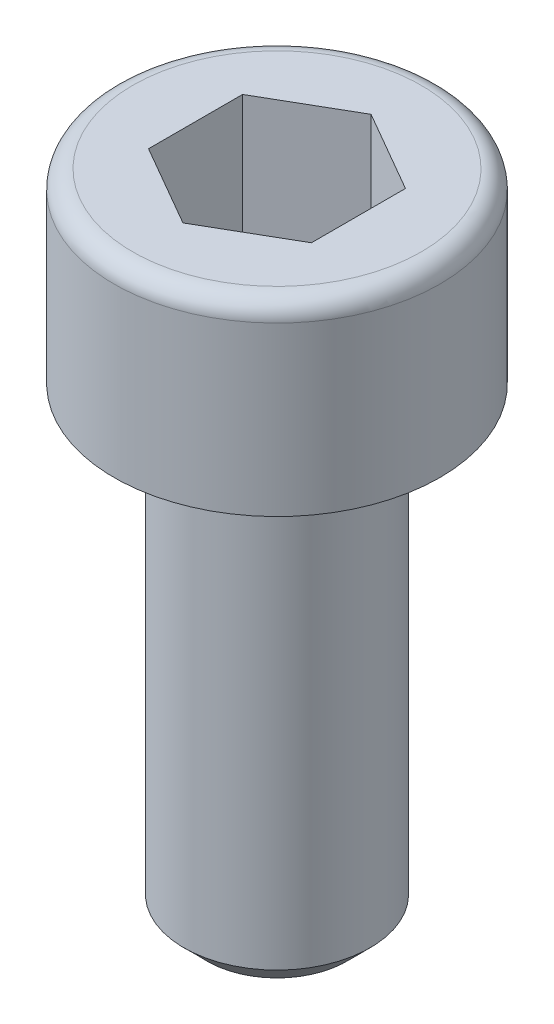
ISO-10303-21;
HEADER;
FILE_DESCRIPTION(('STEP AP214'),'2;1');
FILE_NAME('part.step','',(''),(''),'','','');
FILE_SCHEMA(('AUTOMOTIVE_DESIGN { 1 0 10303 214 1 1 1 1 }'));
ENDSEC;
DATA;
#1=APPLICATION_CONTEXT('core data for automotive mechanical design processes');
#2=APPLICATION_PROTOCOL_DEFINITION('international standard','automotive_design',2000,#1);
#3=PRODUCT_CONTEXT('',#1,'mechanical');
#4=PRODUCT('Part','Part','',(#3));
#5=PRODUCT_RELATED_PRODUCT_CATEGORY('part','',(#4));
#6=PRODUCT_DEFINITION_FORMATION('','',#4);
#7=PRODUCT_DEFINITION_CONTEXT('part definition',#1,'design');
#8=PRODUCT_DEFINITION('design','',#6,#7);
#9=PRODUCT_DEFINITION_SHAPE('','',#8);
#10=(LENGTH_UNIT() NAMED_UNIT(*) SI_UNIT(.MILLI.,.METRE.));
#11=(NAMED_UNIT(*) PLANE_ANGLE_UNIT() SI_UNIT($,.RADIAN.));
#12=(NAMED_UNIT(*) SI_UNIT($,.STERADIAN.) SOLID_ANGLE_UNIT());
#13=UNCERTAINTY_MEASURE_WITH_UNIT(LENGTH_MEASURE(1.E-05),#10,'distance_accuracy_value','');
#14=(GEOMETRIC_REPRESENTATION_CONTEXT(3) GLOBAL_UNCERTAINTY_ASSIGNED_CONTEXT((#13)) GLOBAL_UNIT_ASSIGNED_CONTEXT((#10,
#11,#12)) REPRESENTATION_CONTEXT('',''));
#15=CARTESIAN_POINT('',(0.,0.,0.));
#16=DIRECTION('',(0.,0.,1.));
#17=DIRECTION('',(1.,0.,0.));
#18=AXIS2_PLACEMENT_3D('',#15,#16,#17);
#19=CARTESIAN_POINT('',(1.50000000000001,-14.,0.));
#20=DIRECTION('',(0.,-1.,0.));
#21=DIRECTION('',(1.,0.,0.));
#22=AXIS2_PLACEMENT_3D('',#19,#20,#21);
#23=PLANE('',#22);
#24=CARTESIAN_POINT('',(0.,-14.,0.));
#25=DIRECTION('',(0.,1.,0.));
#26=DIRECTION('',(-1.,0.,0.));
#27=AXIS2_PLACEMENT_3D('',#24,#25,#26);
#28=CIRCLE('',#27,1.5);
#29=CARTESIAN_POINT('',(-1.49999999999999,-14.,0.));
#30=VERTEX_POINT('',#29);
#31=EDGE_CURVE('E11',#30,#30,#28,.T.);
#32=ORIENTED_EDGE('',*,*,#31,.F.);
#33=EDGE_LOOP('',(#32));
#34=FACE_BOUND('',#33,.T.);
#35=ADVANCED_FACE('F350',(#34),#23,.T.);
#36=CARTESIAN_POINT('',(0.,-14.,0.));
#37=DIRECTION('',(0.,1.,0.));
#38=DIRECTION('',(-1.,0.,0.));
#39=AXIS2_PLACEMENT_3D('',#36,#37,#38);
#40=CONICAL_SURFACE('',#39,1.5,0.785398163397462);
#41=CARTESIAN_POINT('',(0.,-13.5,0.));
#42=DIRECTION('',(0.,1.,0.));
#43=DIRECTION('',(-1.,0.,0.));
#44=AXIS2_PLACEMENT_3D('',#41,#42,#43);
#45=CIRCLE('',#44,2.);
#46=CARTESIAN_POINT('',(-1.99999999999999,-13.5,0.));
#47=VERTEX_POINT('',#46);
#48=EDGE_CURVE('E357',#47,#47,#45,.T.);
#49=ORIENTED_EDGE('',*,*,#48,.F.);
#50=EDGE_LOOP('',(#49));
#51=FACE_BOUND('',#50,.T.);
#52=ORIENTED_EDGE('',*,*,#31,.T.);
#53=EDGE_LOOP('',(#52));
#54=FACE_BOUND('',#53,.T.);
#55=ADVANCED_FACE('F473',(#51,#54),#40,.T.);
#56=CARTESIAN_POINT('',(0.,65.1172922252011,0.));
#57=DIRECTION('',(0.,1.,0.));
#58=DIRECTION('',(-1.,0.,0.));
#59=AXIS2_PLACEMENT_3D('',#56,#57,#58);
#60=CYLINDRICAL_SURFACE('',#59,2.);
#61=ORIENTED_EDGE('',*,*,#48,.T.);
#62=EDGE_LOOP('',(#61));
#63=FACE_BOUND('',#62,.T.);
#64=CARTESIAN_POINT('',(0.,-4.,0.));
#65=DIRECTION('',(0.,1.,0.));
#66=DIRECTION('',(-1.,0.,0.));
#67=AXIS2_PLACEMENT_3D('',#64,#65,#66);
#68=CIRCLE('',#67,2.);
#69=CARTESIAN_POINT('',(-1.99999999999999,-4.,0.));
#70=VERTEX_POINT('',#69);
#71=EDGE_CURVE('E465',#70,#70,#68,.T.);
#72=ORIENTED_EDGE('',*,*,#71,.F.);
#73=EDGE_LOOP('',(#72));
#74=FACE_BOUND('',#73,.T.);
#75=ADVANCED_FACE('F470',(#63,#74),#60,.T.);
#76=CARTESIAN_POINT('',(2.00000000000001,-4.,0.));
#77=DIRECTION('',(0.,1.,0.));
#78=DIRECTION('',(-1.,0.,0.));
#79=AXIS2_PLACEMENT_3D('',#76,#77,#78);
#80=PLANE('',#79);
#81=CARTESIAN_POINT('',(0.,-4.,0.));
#82=DIRECTION('',(0.,1.,0.));
#83=DIRECTION('',(-1.,0.,0.));
#84=AXIS2_PLACEMENT_3D('',#81,#82,#83);
#85=CIRCLE('',#84,3.5);
#86=CARTESIAN_POINT('',(-3.49999999999999,-4.,0.));
#87=VERTEX_POINT('',#86);
#88=EDGE_CURVE('E462',#87,#87,#85,.T.);
#89=ORIENTED_EDGE('',*,*,#88,.F.);
#90=EDGE_LOOP('',(#89));
#91=FACE_BOUND('',#90,.T.);
#92=ORIENTED_EDGE('',*,*,#71,.T.);
#93=EDGE_LOOP('',(#92));
#94=FACE_BOUND('',#93,.T.);
#95=ADVANCED_FACE('F491',(#91,#94),#80,.F.);
#96=CARTESIAN_POINT('',(0.,65.1172922252011,0.));
#97=DIRECTION('',(0.,1.,0.));
#98=DIRECTION('',(-1.,0.,0.));
#99=AXIS2_PLACEMENT_3D('',#96,#97,#98);
#100=CYLINDRICAL_SURFACE('',#99,3.5);
#101=CARTESIAN_POINT('',(0.,-0.399999999999998,0.));
#102=DIRECTION('',(0.,1.,0.));
#103=DIRECTION('',(-1.,0.,0.));
#104=AXIS2_PLACEMENT_3D('',#101,#102,#103);
#105=CIRCLE('',#104,3.5);
#106=CARTESIAN_POINT('',(-3.49999999999999,-0.399999999999998,0.));
#107=VERTEX_POINT('',#106);
#108=EDGE_CURVE('E459',#107,#107,#105,.T.);
#109=ORIENTED_EDGE('',*,*,#108,.F.);
#110=EDGE_LOOP('',(#109));
#111=FACE_BOUND('',#110,.T.);
#112=ORIENTED_EDGE('',*,*,#88,.T.);
#113=EDGE_LOOP('',(#112));
#114=FACE_BOUND('',#113,.T.);
#115=ADVANCED_FACE('F498',(#111,#114),#100,.T.);
#116=CARTESIAN_POINT('',(0.,-0.399999999999998,0.));
#117=DIRECTION('',(0.,1.,0.));
#118=DIRECTION('',(-1.,0.,0.));
#119=AXIS2_PLACEMENT_3D('',#116,#117,#118);
#120=TOROIDAL_SURFACE('',#119,3.1,0.4);
#121=CARTESIAN_POINT('',(0.,0.,0.));
#122=DIRECTION('',(0.,1.,0.));
#123=DIRECTION('',(-1.,0.,0.));
#124=AXIS2_PLACEMENT_3D('',#121,#122,#123);
#125=CIRCLE('',#124,3.1);
#126=CARTESIAN_POINT('',(-3.09999999999999,0.,0.));
#127=VERTEX_POINT('',#126);
#128=EDGE_CURVE('E450',#127,#127,#125,.T.);
#129=ORIENTED_EDGE('',*,*,#128,.F.);
#130=EDGE_LOOP('',(#129));
#131=FACE_BOUND('',#130,.T.);
#132=ORIENTED_EDGE('',*,*,#108,.T.);
#133=EDGE_LOOP('',(#132));
#134=FACE_BOUND('',#133,.T.);
#135=ADVANCED_FACE('F506',(#131,#134),#120,.T.);
#136=CARTESIAN_POINT('',(3.10000000000001,0.,0.));
#137=DIRECTION('',(0.,-1.,0.));
#138=DIRECTION('',(1.,0.,0.));
#139=AXIS2_PLACEMENT_3D('',#136,#137,#138);
#140=PLANE('',#139);
#141=DIRECTION('',(0.,0.,1.));
#142=VECTOR('',#141,1.);
#143=CARTESIAN_POINT('',(-1.75,0.,-1.01036297108185));
#144=LINE('',#143,#142);
#145=CARTESIAN_POINT('',(-1.75,0.,-1.01036297108185));
#146=VERTEX_POINT('',#145);
#147=CARTESIAN_POINT('',(-1.75,0.,1.01036297108185));
#148=VERTEX_POINT('',#147);
#149=EDGE_CURVE('E427',#146,#148,#144,.T.);
#150=ORIENTED_EDGE('',*,*,#149,.F.);
#151=DIRECTION('',(-0.866025403784439,0.,0.5));
#152=VECTOR('',#151,1.);
#153=CARTESIAN_POINT('',(0.,0.,-2.02072594216369));
#154=LINE('',#153,#152);
#155=CARTESIAN_POINT('',(0.,0.,-2.02072594216369));
#156=VERTEX_POINT('',#155);
#157=EDGE_CURVE('E364',#156,#146,#154,.T.);
#158=ORIENTED_EDGE('',*,*,#157,.F.);
#159=DIRECTION('',(0.866025403784439,0.,0.5));
#160=VECTOR('',#159,1.);
#161=CARTESIAN_POINT('',(0.,0.,-2.02072594216369));
#162=LINE('',#161,#160);
#163=CARTESIAN_POINT('',(1.75,0.,-1.01036297108185));
#164=VERTEX_POINT('',#163);
#165=EDGE_CURVE('E635',#156,#164,#162,.T.);
#166=ORIENTED_EDGE('',*,*,#165,.T.);
#167=DIRECTION('',(0.,0.,1.));
#168=VECTOR('',#167,1.);
#169=CARTESIAN_POINT('',(1.75,0.,-1.01036297108185));
#170=LINE('',#169,#168);
#171=CARTESIAN_POINT('',(1.75,0.,1.01036297108185));
#172=VERTEX_POINT('',#171);
#173=EDGE_CURVE('E632',#164,#172,#170,.T.);
#174=ORIENTED_EDGE('',*,*,#173,.T.);
#175=DIRECTION('',(-0.866025403784439,0.,0.5));
#176=VECTOR('',#175,1.);
#177=CARTESIAN_POINT('',(1.75,0.,1.01036297108185));
#178=LINE('',#177,#176);
#179=CARTESIAN_POINT('',(0.,0.,2.02072594216369));
#180=VERTEX_POINT('',#179);
#181=EDGE_CURVE('E629',#172,#180,#178,.T.);
#182=ORIENTED_EDGE('',*,*,#181,.T.);
#183=DIRECTION('',(0.866025403784439,0.,0.5));
#184=VECTOR('',#183,1.);
#185=CARTESIAN_POINT('',(-1.75,0.,1.01036297108185));
#186=LINE('',#185,#184);
#187=EDGE_CURVE('E627',#148,#180,#186,.T.);
#188=ORIENTED_EDGE('',*,*,#187,.F.);
#189=EDGE_LOOP('',(#150,#158,#166,#174,#182,#188));
#190=FACE_BOUND('',#189,.T.);
#191=ORIENTED_EDGE('',*,*,#128,.T.);
#192=EDGE_LOOP('',(#191));
#193=FACE_BOUND('',#192,.T.);
#194=ADVANCED_FACE('F514',(#190,#193),#140,.F.);
#195=CARTESIAN_POINT('',(0.,-2.88,-2.02072594216369));
#196=DIRECTION('',(-0.5,0.,-0.866025403784439));
#197=DIRECTION('',(-0.866025403784439,0.,0.5));
#198=AXIS2_PLACEMENT_3D('',#195,#196,#197);
#199=PLANE('',#198);
#200=ORIENTED_EDGE('',*,*,#157,.T.);
#201=DIRECTION('',(0.,1.,0.));
#202=VECTOR('',#201,1.);
#203=CARTESIAN_POINT('',(-1.75,-2.88,-1.01036297108185));
#204=LINE('',#203,#202);
#205=CARTESIAN_POINT('',(-1.75,-2.88,-1.01036297108185));
#206=VERTEX_POINT('',#205);
#207=EDGE_CURVE('E432',#206,#146,#204,.T.);
#208=ORIENTED_EDGE('',*,*,#207,.F.);
#209=DIRECTION('',(-0.866025403784439,0.,0.5));
#210=VECTOR('',#209,1.);
#211=CARTESIAN_POINT('',(0.,-2.88,-2.02072594216369));
#212=LINE('',#211,#210);
#213=CARTESIAN_POINT('',(0.,-2.88,-2.02072594216369));
#214=VERTEX_POINT('',#213);
#215=EDGE_CURVE('E421',#214,#206,#212,.T.);
#216=ORIENTED_EDGE('',*,*,#215,.F.);
#217=DIRECTION('',(0.,1.,0.));
#218=VECTOR('',#217,1.);
#219=CARTESIAN_POINT('',(0.,-2.88,-2.02072594216369));
#220=LINE('',#219,#218);
#221=EDGE_CURVE('E448',#214,#156,#220,.T.);
#222=ORIENTED_EDGE('',*,*,#221,.T.);
#223=EDGE_LOOP('',(#200,#208,#216,#222));
#224=FACE_BOUND('',#223,.T.);
#225=ADVANCED_FACE('F522',(#224),#199,.F.);
#226=CARTESIAN_POINT('',(0.,-2.88,-2.02072594216369));
#227=DIRECTION('',(-0.5,0.,0.866025403784439));
#228=DIRECTION('',(0.866025403784439,0.,0.5));
#229=AXIS2_PLACEMENT_3D('',#226,#227,#228);
#230=PLANE('',#229);
#231=ORIENTED_EDGE('',*,*,#165,.F.);
#232=ORIENTED_EDGE('',*,*,#221,.F.);
#233=DIRECTION('',(0.866025403784439,0.,0.5));
#234=VECTOR('',#233,1.);
#235=CARTESIAN_POINT('',(0.,-2.88,-2.02072594216369));
#236=LINE('',#235,#234);
#237=CARTESIAN_POINT('',(1.75,-2.88,-1.01036297108185));
#238=VERTEX_POINT('',#237);
#239=EDGE_CURVE('E445',#214,#238,#236,.T.);
#240=ORIENTED_EDGE('',*,*,#239,.T.);
#241=DIRECTION('',(0.,1.,0.));
#242=VECTOR('',#241,1.);
#243=CARTESIAN_POINT('',(1.75,-2.88,-1.01036297108185));
#244=LINE('',#243,#242);
#245=EDGE_CURVE('E451',#238,#164,#244,.T.);
#246=ORIENTED_EDGE('',*,*,#245,.T.);
#247=EDGE_LOOP('',(#231,#232,#240,#246));
#248=FACE_BOUND('',#247,.T.);
#249=ADVANCED_FACE('F530',(#248),#230,.T.);
#250=CARTESIAN_POINT('',(1.75,-2.88,-1.01036297108185));
#251=DIRECTION('',(-1.,0.,0.));
#252=DIRECTION('',(0.,-1.,0.));
#253=AXIS2_PLACEMENT_3D('',#250,#251,#252);
#254=PLANE('',#253);
#255=ORIENTED_EDGE('',*,*,#173,.F.);
#256=ORIENTED_EDGE('',*,*,#245,.F.);
#257=DIRECTION('',(0.,0.,1.));
#258=VECTOR('',#257,1.);
#259=CARTESIAN_POINT('',(1.75,-2.88,-1.01036297108185));
#260=LINE('',#259,#258);
#261=CARTESIAN_POINT('',(1.75,-2.88,1.01036297108185));
#262=VERTEX_POINT('',#261);
#263=EDGE_CURVE('E439',#238,#262,#260,.T.);
#264=ORIENTED_EDGE('',*,*,#263,.T.);
#265=DIRECTION('',(0.,1.,0.));
#266=VECTOR('',#265,1.);
#267=CARTESIAN_POINT('',(1.75,-2.88,1.01036297108185));
#268=LINE('',#267,#266);
#269=EDGE_CURVE('E453',#262,#172,#268,.T.);
#270=ORIENTED_EDGE('',*,*,#269,.T.);
#271=EDGE_LOOP('',(#255,#256,#264,#270));
#272=FACE_BOUND('',#271,.T.);
#273=ADVANCED_FACE('F537',(#272),#254,.T.);
#274=CARTESIAN_POINT('',(1.75,-2.88,1.01036297108185));
#275=DIRECTION('',(-0.5,0.,-0.866025403784439));
#276=DIRECTION('',(-0.866025403784439,0.,0.5));
#277=AXIS2_PLACEMENT_3D('',#274,#275,#276);
#278=PLANE('',#277);
#279=ORIENTED_EDGE('',*,*,#181,.F.);
#280=ORIENTED_EDGE('',*,*,#269,.F.);
#281=DIRECTION('',(-0.866025403784439,0.,0.5));
#282=VECTOR('',#281,1.);
#283=CARTESIAN_POINT('',(1.75,-2.88,1.01036297108185));
#284=LINE('',#283,#282);
#285=CARTESIAN_POINT('',(0.,-2.88,2.02072594216369));
#286=VERTEX_POINT('',#285);
#287=EDGE_CURVE('E436',#262,#286,#284,.T.);
#288=ORIENTED_EDGE('',*,*,#287,.T.);
#289=DIRECTION('',(0.,1.,0.));
#290=VECTOR('',#289,1.);
#291=CARTESIAN_POINT('',(0.,-2.88,2.02072594216369));
#292=LINE('',#291,#290);
#293=EDGE_CURVE('E431',#286,#180,#292,.T.);
#294=ORIENTED_EDGE('',*,*,#293,.T.);
#295=EDGE_LOOP('',(#279,#280,#288,#294));
#296=FACE_BOUND('',#295,.T.);
#297=ADVANCED_FACE('F545',(#296),#278,.T.);
#298=CARTESIAN_POINT('',(-1.75,-2.88,1.01036297108185));
#299=DIRECTION('',(-0.5,0.,0.866025403784439));
#300=DIRECTION('',(0.866025403784439,0.,0.5));
#301=AXIS2_PLACEMENT_3D('',#298,#299,#300);
#302=PLANE('',#301);
#303=ORIENTED_EDGE('',*,*,#187,.T.);
#304=ORIENTED_EDGE('',*,*,#293,.F.);
#305=DIRECTION('',(0.866025403784439,0.,0.5));
#306=VECTOR('',#305,1.);
#307=CARTESIAN_POINT('',(-1.75,-2.88,1.01036297108185));
#308=LINE('',#307,#306);
#309=CARTESIAN_POINT('',(-1.75,-2.88,1.01036297108185));
#310=VERTEX_POINT('',#309);
#311=EDGE_CURVE('E372',#310,#286,#308,.T.);
#312=ORIENTED_EDGE('',*,*,#311,.F.);
#313=DIRECTION('',(0.,1.,0.));
#314=VECTOR('',#313,1.);
#315=CARTESIAN_POINT('',(-1.75,-2.88,1.01036297108185));
#316=LINE('',#315,#314);
#317=EDGE_CURVE('E424',#310,#148,#316,.T.);
#318=ORIENTED_EDGE('',*,*,#317,.T.);
#319=EDGE_LOOP('',(#303,#304,#312,#318));
#320=FACE_BOUND('',#319,.T.);
#321=ADVANCED_FACE('F435',(#320),#302,.F.);
#322=CARTESIAN_POINT('',(-1.75,-2.88,-1.01036297108185));
#323=DIRECTION('',(-1.,0.,0.));
#324=DIRECTION('',(0.,-1.,0.));
#325=AXIS2_PLACEMENT_3D('',#322,#323,#324);
#326=PLANE('',#325);
#327=ORIENTED_EDGE('',*,*,#149,.T.);
#328=ORIENTED_EDGE('',*,*,#317,.F.);
#329=DIRECTION('',(0.,0.,1.));
#330=VECTOR('',#329,1.);
#331=CARTESIAN_POINT('',(-1.75,-2.88,-1.01036297108185));
#332=LINE('',#331,#330);
#333=EDGE_CURVE('E414',#206,#310,#332,.T.);
#334=ORIENTED_EDGE('',*,*,#333,.F.);
#335=ORIENTED_EDGE('',*,*,#207,.T.);
#336=EDGE_LOOP('',(#327,#328,#334,#335));
#337=FACE_BOUND('',#336,.T.);
#338=ADVANCED_FACE('F425',(#337),#326,.F.);
#339=CARTESIAN_POINT('',(-1.75,-2.88,-1.01036297108185));
#340=DIRECTION('',(0.0899373291932057,0.983689538050686,0.15577602365968));
#341=DIRECTION('',(0.,-0.156409886183001,0.987692233190188));
#342=AXIS2_PLACEMENT_3D('',#339,#340,#341);
#343=PLANE('',#342);
#344=DIRECTION('',(-0.855366565063286,0.156409886183001,-0.493846116595094));
#345=VECTOR('',#344,1.);
#346=CARTESIAN_POINT('',(0.,-3.2,0.));
#347=LINE('',#346,#345);
#348=CARTESIAN_POINT('',(0.,-3.2,0.));
#349=VERTEX_POINT('',#348);
#350=EDGE_CURVE('E418',#349,#206,#347,.T.);
#351=ORIENTED_EDGE('',*,*,#350,.F.);
#352=DIRECTION('',(0.,0.156409886183001,-0.987692233190188));
#353=VECTOR('',#352,1.);
#354=CARTESIAN_POINT('',(0.,-3.2,0.));
#355=LINE('',#354,#353);
#356=EDGE_CURVE('E616',#349,#214,#355,.T.);
#357=ORIENTED_EDGE('',*,*,#356,.T.);
#358=ORIENTED_EDGE('',*,*,#215,.T.);
#359=EDGE_LOOP('',(#351,#357,#358));
#360=FACE_BOUND('',#359,.T.);
#361=ADVANCED_FACE('F566',(#360),#343,.T.);
#362=CARTESIAN_POINT('',(0.,-2.88,-2.02072594216369));
#363=DIRECTION('',(-0.0899373291932057,0.983689538050686,0.15577602365968));
#364=DIRECTION('',(0.,-0.156409886183001,0.987692233190188));
#365=AXIS2_PLACEMENT_3D('',#362,#363,#364);
#366=PLANE('',#365);
#367=ORIENTED_EDGE('',*,*,#356,.F.);
#368=DIRECTION('',(0.855366565063286,0.156409886183001,-0.493846116595094));
#369=VECTOR('',#368,1.);
#370=CARTESIAN_POINT('',(0.,-3.2,0.));
#371=LINE('',#370,#369);
#372=EDGE_CURVE('E410',#349,#238,#371,.T.);
#373=ORIENTED_EDGE('',*,*,#372,.T.);
#374=ORIENTED_EDGE('',*,*,#239,.F.);
#375=EDGE_LOOP('',(#367,#373,#374));
#376=FACE_BOUND('',#375,.T.);
#377=ADVANCED_FACE('F574',(#376),#366,.T.);
#378=CARTESIAN_POINT('',(-1.75,-2.88,1.01036297108184));
#379=DIRECTION('',(0.179874658386411,0.983689538050686,0.));
#380=DIRECTION('',(-0.983689538050686,0.179874658386411,0.));
#381=AXIS2_PLACEMENT_3D('',#378,#379,#380);
#382=PLANE('',#381);
#383=DIRECTION('',(-0.855366565063286,0.156409886183001,0.493846116595094));
#384=VECTOR('',#383,1.);
#385=CARTESIAN_POINT('',(0.,-3.2,0.));
#386=LINE('',#385,#384);
#387=EDGE_CURVE('E404',#349,#310,#386,.T.);
#388=ORIENTED_EDGE('',*,*,#387,.F.);
#389=ORIENTED_EDGE('',*,*,#350,.T.);
#390=ORIENTED_EDGE('',*,*,#333,.T.);
#391=EDGE_LOOP('',(#388,#389,#390));
#392=FACE_BOUND('',#391,.T.);
#393=ADVANCED_FACE('F416',(#392),#382,.T.);
#394=CARTESIAN_POINT('',(1.75,-2.88,-1.01036297108184));
#395=DIRECTION('',(-0.179874658386411,0.983689538050686,0.));
#396=DIRECTION('',(-0.983689538050686,-0.179874658386411,0.));
#397=AXIS2_PLACEMENT_3D('',#394,#395,#396);
#398=PLANE('',#397);
#399=ORIENTED_EDGE('',*,*,#372,.F.);
#400=DIRECTION('',(0.855366565063286,0.156409886183001,0.493846116595094));
#401=VECTOR('',#400,1.);
#402=CARTESIAN_POINT('',(0.,-3.2,0.));
#403=LINE('',#402,#401);
#404=EDGE_CURVE('E411',#349,#262,#403,.T.);
#405=ORIENTED_EDGE('',*,*,#404,.T.);
#406=ORIENTED_EDGE('',*,*,#263,.F.);
#407=EDGE_LOOP('',(#399,#405,#406));
#408=FACE_BOUND('',#407,.T.);
#409=ADVANCED_FACE('F589',(#408),#398,.T.);
#410=CARTESIAN_POINT('',(0.,-2.88,2.02072594216369));
#411=DIRECTION('',(0.0899373291932057,0.983689538050686,-0.15577602365968));
#412=DIRECTION('',(0.,0.156409886183001,0.987692233190188));
#413=AXIS2_PLACEMENT_3D('',#410,#411,#412);
#414=PLANE('',#413);
#415=DIRECTION('',(0.,0.156409886183001,0.987692233190188));
#416=VECTOR('',#415,1.);
#417=CARTESIAN_POINT('',(0.,-3.2,0.));
#418=LINE('',#417,#416);
#419=EDGE_CURVE('E407',#349,#286,#418,.T.);
#420=ORIENTED_EDGE('',*,*,#419,.F.);
#421=ORIENTED_EDGE('',*,*,#387,.T.);
#422=ORIENTED_EDGE('',*,*,#311,.T.);
#423=EDGE_LOOP('',(#420,#421,#422));
#424=FACE_BOUND('',#423,.T.);
#425=ADVANCED_FACE('F406',(#424),#414,.T.);
#426=CARTESIAN_POINT('',(1.75,-2.88,1.01036297108185));
#427=DIRECTION('',(-0.0899373291932057,0.983689538050686,-0.15577602365968));
#428=DIRECTION('',(0.,0.156409886183001,0.987692233190188));
#429=AXIS2_PLACEMENT_3D('',#426,#427,#428);
#430=PLANE('',#429);
#431=ORIENTED_EDGE('',*,*,#404,.F.);
#432=ORIENTED_EDGE('',*,*,#419,.T.);
#433=ORIENTED_EDGE('',*,*,#287,.F.);
#434=EDGE_LOOP('',(#431,#432,#433));
#435=FACE_BOUND('',#434,.T.);
#436=ADVANCED_FACE('F568',(#435),#430,.T.);
#437=CLOSED_SHELL('',(#35,#55,#75,#95,#115,#135,#194,#225,#249,#273,#297,#321,#338,#361,#377,
#393,#409,#425,#436));
#438=MANIFOLD_SOLID_BREP('B2',#437);
#439=ADVANCED_BREP_SHAPE_REPRESENTATION('',(#18,#438),#14);
#440=SHAPE_DEFINITION_REPRESENTATION(#9,#439);
ENDSEC;
END-ISO-10303-21;
